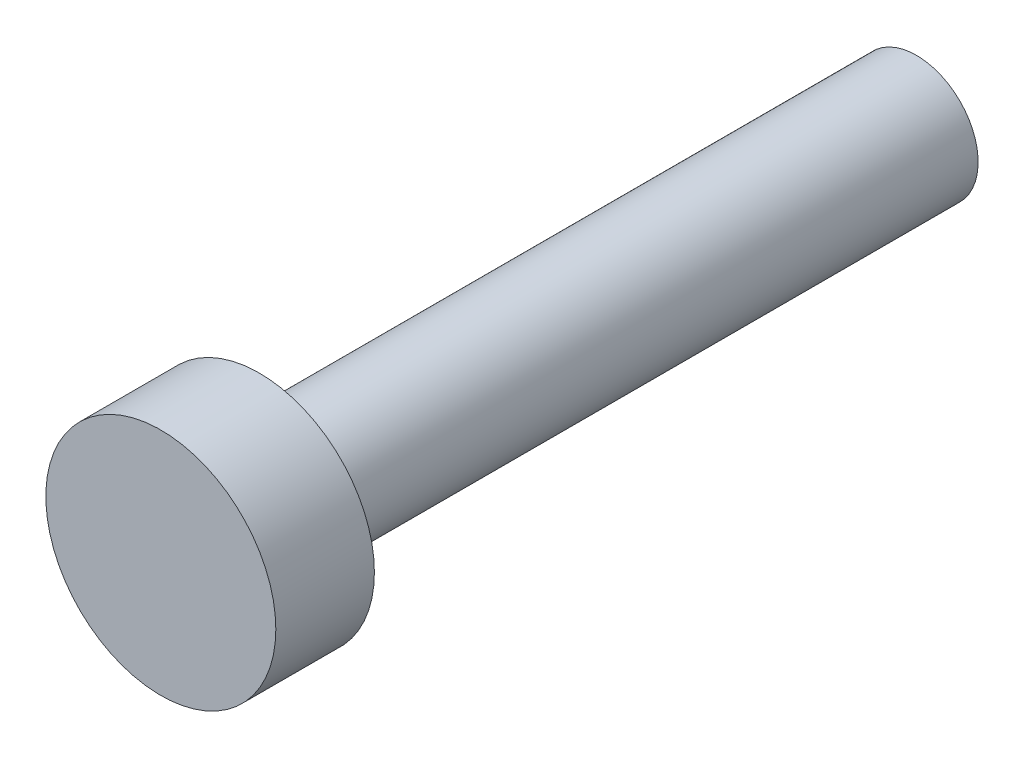
ISO-10303-21;
HEADER;
FILE_DESCRIPTION(('STEP AP214'),'2;1');
FILE_NAME('part.step','',(''),(''),'','','');
FILE_SCHEMA(('AUTOMOTIVE_DESIGN { 1 0 10303 214 1 1 1 1 }'));
ENDSEC;
DATA;
#1=APPLICATION_CONTEXT('core data for automotive mechanical design processes');
#2=APPLICATION_PROTOCOL_DEFINITION('international standard','automotive_design',2000,#1);
#3=PRODUCT_CONTEXT('',#1,'mechanical');
#4=PRODUCT('Part','Part','',(#3));
#5=PRODUCT_RELATED_PRODUCT_CATEGORY('part','',(#4));
#6=PRODUCT_DEFINITION_FORMATION('','',#4);
#7=PRODUCT_DEFINITION_CONTEXT('part definition',#1,'design');
#8=PRODUCT_DEFINITION('design','',#6,#7);
#9=PRODUCT_DEFINITION_SHAPE('','',#8);
#10=(LENGTH_UNIT() NAMED_UNIT(*) SI_UNIT(.MILLI.,.METRE.));
#11=(NAMED_UNIT(*) PLANE_ANGLE_UNIT() SI_UNIT($,.RADIAN.));
#12=(NAMED_UNIT(*) SI_UNIT($,.STERADIAN.) SOLID_ANGLE_UNIT());
#13=UNCERTAINTY_MEASURE_WITH_UNIT(LENGTH_MEASURE(1.E-05),#10,'distance_accuracy_value','');
#14=(GEOMETRIC_REPRESENTATION_CONTEXT(3) GLOBAL_UNCERTAINTY_ASSIGNED_CONTEXT((#13)) GLOBAL_UNIT_ASSIGNED_CONTEXT((#10,
#11,#12)) REPRESENTATION_CONTEXT('',''));
#15=CARTESIAN_POINT('',(0.,0.,0.));
#16=DIRECTION('',(0.,0.,1.));
#17=DIRECTION('',(1.,0.,0.));
#18=AXIS2_PLACEMENT_3D('',#15,#16,#17);
#19=CARTESIAN_POINT('',(0.,0.,2.4));
#20=DIRECTION('',(0.,0.,-1.));
#21=DIRECTION('',(-1.,0.,0.));
#22=AXIS2_PLACEMENT_3D('',#19,#20,#21);
#23=CYLINDRICAL_SURFACE('',#22,2.8);
#24=CARTESIAN_POINT('',(0.,0.,2.4));
#25=DIRECTION('',(0.,0.,1.));
#26=DIRECTION('',(1.,0.,0.));
#27=AXIS2_PLACEMENT_3D('',#24,#25,#26);
#28=CIRCLE('',#27,2.8);
#29=CARTESIAN_POINT('',(2.8,0.,2.4));
#30=VERTEX_POINT('',#29);
#31=EDGE_CURVE('E37',#30,#30,#28,.T.);
#32=ORIENTED_EDGE('',*,*,#31,.F.);
#33=EDGE_LOOP('',(#32));
#34=FACE_BOUND('',#33,.T.);
#35=CARTESIAN_POINT('',(0.,0.,0.));
#36=DIRECTION('',(0.,0.,1.));
#37=DIRECTION('',(1.,0.,0.));
#38=AXIS2_PLACEMENT_3D('',#35,#36,#37);
#39=CIRCLE('',#38,2.8);
#40=CARTESIAN_POINT('',(2.8,0.,0.));
#41=VERTEX_POINT('',#40);
#42=EDGE_CURVE('E33',#41,#41,#39,.T.);
#43=ORIENTED_EDGE('',*,*,#42,.T.);
#44=EDGE_LOOP('',(#43));
#45=FACE_BOUND('',#44,.T.);
#46=ADVANCED_FACE('F30',(#34,#45),#23,.T.);
#47=CARTESIAN_POINT('',(0.,0.,2.4));
#48=DIRECTION('',(0.,0.,1.));
#49=DIRECTION('',(1.,0.,0.));
#50=AXIS2_PLACEMENT_3D('',#47,#48,#49);
#51=PLANE('',#50);
#52=ORIENTED_EDGE('',*,*,#31,.T.);
#53=EDGE_LOOP('',(#52));
#54=FACE_BOUND('',#53,.T.);
#55=ADVANCED_FACE('F54',(#54),#51,.T.);
#56=CARTESIAN_POINT('',(0.,0.,0.));
#57=DIRECTION('',(0.,0.,1.));
#58=DIRECTION('',(1.,0.,0.));
#59=AXIS2_PLACEMENT_3D('',#56,#57,#58);
#60=PLANE('',#59);
#61=CARTESIAN_POINT('',(0.,0.,0.));
#62=DIRECTION('',(0.,0.,-1.));
#63=DIRECTION('',(-1.,0.,0.));
#64=AXIS2_PLACEMENT_3D('',#61,#62,#63);
#65=CIRCLE('',#64,1.5);
#66=CARTESIAN_POINT('',(-1.5,0.,0.));
#67=VERTEX_POINT('',#66);
#68=EDGE_CURVE('E10',#67,#67,#65,.T.);
#69=ORIENTED_EDGE('',*,*,#68,.F.);
#70=EDGE_LOOP('',(#69));
#71=FACE_BOUND('',#70,.T.);
#72=ORIENTED_EDGE('',*,*,#42,.F.);
#73=EDGE_LOOP('',(#72));
#74=FACE_BOUND('',#73,.T.);
#75=ADVANCED_FACE('F51',(#71,#74),#60,.F.);
#76=CARTESIAN_POINT('',(0.,0.,-16.));
#77=DIRECTION('',(0.,0.,1.));
#78=DIRECTION('',(1.,0.,0.));
#79=AXIS2_PLACEMENT_3D('',#76,#77,#78);
#80=CYLINDRICAL_SURFACE('',#79,1.5);
#81=CARTESIAN_POINT('',(0.,0.,-16.));
#82=DIRECTION('',(0.,0.,-1.));
#83=DIRECTION('',(-1.,0.,0.));
#84=AXIS2_PLACEMENT_3D('',#81,#82,#83);
#85=CIRCLE('',#84,1.5);
#86=CARTESIAN_POINT('',(-1.5,0.,-16.));
#87=VERTEX_POINT('',#86);
#88=EDGE_CURVE('E43',#87,#87,#85,.T.);
#89=ORIENTED_EDGE('',*,*,#88,.F.);
#90=EDGE_LOOP('',(#89));
#91=FACE_BOUND('',#90,.T.);
#92=ORIENTED_EDGE('',*,*,#68,.T.);
#93=EDGE_LOOP('',(#92));
#94=FACE_BOUND('',#93,.T.);
#95=ADVANCED_FACE('F53',(#91,#94),#80,.T.);
#96=CARTESIAN_POINT('',(0.,0.,-16.));
#97=DIRECTION('',(0.,0.,-1.));
#98=DIRECTION('',(-1.,0.,0.));
#99=AXIS2_PLACEMENT_3D('',#96,#97,#98);
#100=PLANE('',#99);
#101=ORIENTED_EDGE('',*,*,#88,.T.);
#102=EDGE_LOOP('',(#101));
#103=FACE_BOUND('',#102,.T.);
#104=ADVANCED_FACE('F60',(#103),#100,.T.);
#105=CLOSED_SHELL('',(#46,#55,#75,#95,#104));
#106=MANIFOLD_SOLID_BREP('B2',#105);
#107=ADVANCED_BREP_SHAPE_REPRESENTATION('',(#18,#106),#14);
#108=SHAPE_DEFINITION_REPRESENTATION(#9,#107);
ENDSEC;
END-ISO-10303-21;
